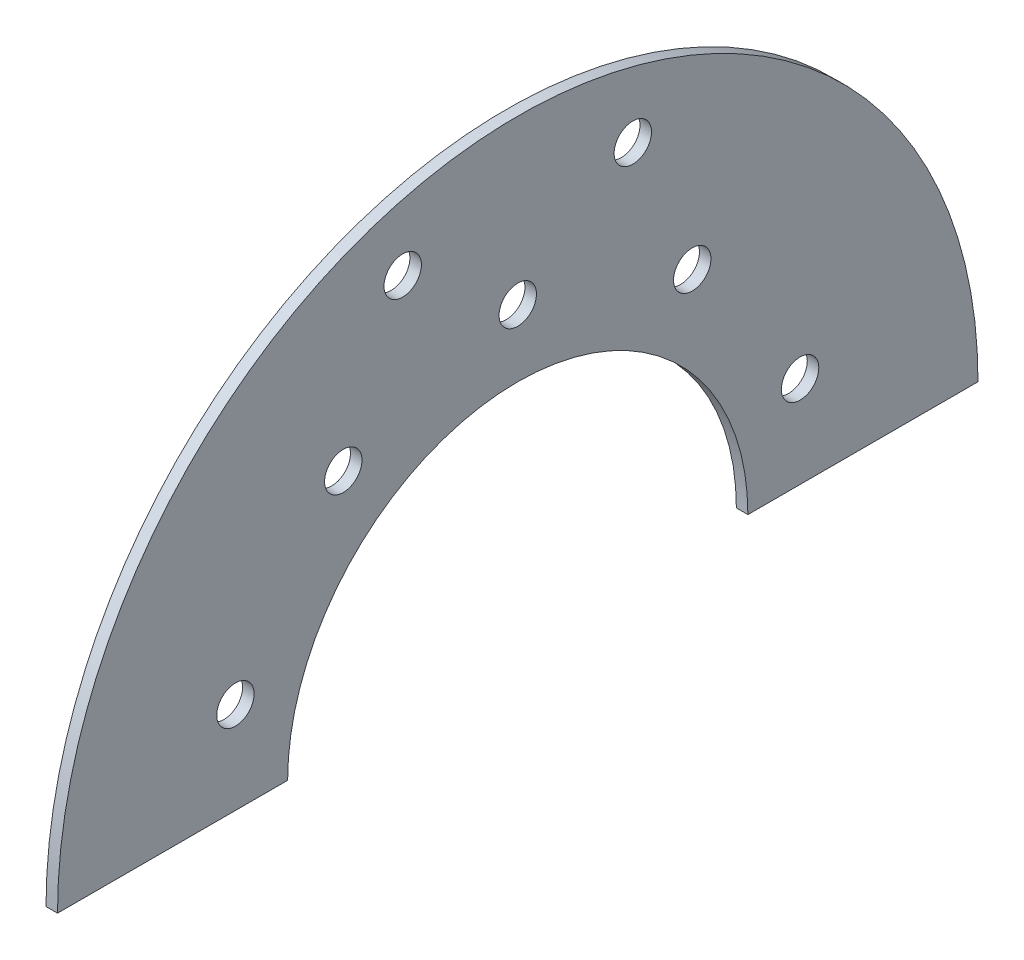
ISO-10303-21;
HEADER;
FILE_DESCRIPTION(('STEP AP214'),'2;1');
FILE_NAME('part.step','',(''),(''),'','','');
FILE_SCHEMA(('AUTOMOTIVE_DESIGN { 1 0 10303 214 1 1 1 1 }'));
ENDSEC;
DATA;
#1=APPLICATION_CONTEXT('core data for automotive mechanical design processes');
#2=APPLICATION_PROTOCOL_DEFINITION('international standard','automotive_design',2000,#1);
#3=PRODUCT_CONTEXT('',#1,'mechanical');
#4=PRODUCT('Part','Part','',(#3));
#5=PRODUCT_RELATED_PRODUCT_CATEGORY('part','',(#4));
#6=PRODUCT_DEFINITION_FORMATION('','',#4);
#7=PRODUCT_DEFINITION_CONTEXT('part definition',#1,'design');
#8=PRODUCT_DEFINITION('design','',#6,#7);
#9=PRODUCT_DEFINITION_SHAPE('','',#8);
#10=(LENGTH_UNIT() NAMED_UNIT(*) SI_UNIT(.MILLI.,.METRE.));
#11=(NAMED_UNIT(*) PLANE_ANGLE_UNIT() SI_UNIT($,.RADIAN.));
#12=(NAMED_UNIT(*) SI_UNIT($,.STERADIAN.) SOLID_ANGLE_UNIT());
#13=UNCERTAINTY_MEASURE_WITH_UNIT(LENGTH_MEASURE(1.E-05),#10,'distance_accuracy_value','');
#14=(GEOMETRIC_REPRESENTATION_CONTEXT(3) GLOBAL_UNCERTAINTY_ASSIGNED_CONTEXT((#13)) GLOBAL_UNIT_ASSIGNED_CONTEXT((#10,
#11,#12)) REPRESENTATION_CONTEXT('',''));
#15=CARTESIAN_POINT('',(0.,0.,0.));
#16=DIRECTION('',(0.,0.,1.));
#17=DIRECTION('',(1.,0.,0.));
#18=AXIS2_PLACEMENT_3D('',#15,#16,#17);
#19=CARTESIAN_POINT('',(0.,0.,0.));
#20=DIRECTION('',(0.,1.,0.));
#21=DIRECTION('',(0.,0.,1.));
#22=AXIS2_PLACEMENT_3D('',#19,#20,#21);
#23=PLANE('',#22);
#24=DIRECTION('',(0.,0.,1.));
#25=VECTOR('',#24,1.);
#26=CARTESIAN_POINT('',(2.,0.,0.));
#27=LINE('',#26,#25);
#28=CARTESIAN_POINT('',(2.,0.,-80.));
#29=VERTEX_POINT('',#28);
#30=CARTESIAN_POINT('',(2.,0.,-40.));
#31=VERTEX_POINT('',#30);
#32=EDGE_CURVE('E76',#29,#31,#27,.T.);
#33=ORIENTED_EDGE('',*,*,#32,.T.);
#34=DIRECTION('',(-1.,0.,0.));
#35=VECTOR('',#34,1.);
#36=CARTESIAN_POINT('',(2.,0.,-40.));
#37=LINE('',#36,#35);
#38=CARTESIAN_POINT('',(0.,0.,-40.));
#39=VERTEX_POINT('',#38);
#40=EDGE_CURVE('E40',#31,#39,#37,.T.);
#41=ORIENTED_EDGE('',*,*,#40,.T.);
#42=DIRECTION('',(0.,0.,1.));
#43=VECTOR('',#42,1.);
#44=CARTESIAN_POINT('',(0.,0.,0.));
#45=LINE('',#44,#43);
#46=CARTESIAN_POINT('',(0.,0.,-80.));
#47=VERTEX_POINT('',#46);
#48=EDGE_CURVE('E77',#47,#39,#45,.T.);
#49=ORIENTED_EDGE('',*,*,#48,.F.);
#50=DIRECTION('',(-1.,0.,0.));
#51=VECTOR('',#50,1.);
#52=CARTESIAN_POINT('',(2.,0.,-80.));
#53=LINE('',#52,#51);
#54=EDGE_CURVE('E35',#29,#47,#53,.T.);
#55=ORIENTED_EDGE('',*,*,#54,.F.);
#56=EDGE_LOOP('',(#33,#41,#49,#55));
#57=FACE_BOUND('',#56,.T.);
#58=ADVANCED_FACE('F32',(#57),#23,.F.);
#59=CARTESIAN_POINT('',(0.,0.,40.));
#60=VERTEX_POINT('',#59);
#61=CARTESIAN_POINT('',(0.,0.,80.));
#62=VERTEX_POINT('',#61);
#63=EDGE_CURVE('E82',#60,#62,#45,.T.);
#64=ORIENTED_EDGE('',*,*,#63,.F.);
#65=DIRECTION('',(-1.,0.,0.));
#66=VECTOR('',#65,1.);
#67=CARTESIAN_POINT('',(2.,0.,40.));
#68=LINE('',#67,#66);
#69=CARTESIAN_POINT('',(2.,0.,40.));
#70=VERTEX_POINT('',#69);
#71=EDGE_CURVE('E11',#60,#70,#68,.F.);
#72=ORIENTED_EDGE('',*,*,#71,.T.);
#73=CARTESIAN_POINT('',(2.,0.,80.));
#74=VERTEX_POINT('',#73);
#75=EDGE_CURVE('E55',#70,#74,#27,.T.);
#76=ORIENTED_EDGE('',*,*,#75,.T.);
#77=DIRECTION('',(-1.,0.,0.));
#78=VECTOR('',#77,1.);
#79=CARTESIAN_POINT('',(2.,0.,80.));
#80=LINE('',#79,#78);
#81=EDGE_CURVE('E83',#62,#74,#80,.F.);
#82=ORIENTED_EDGE('',*,*,#81,.F.);
#83=EDGE_LOOP('',(#64,#72,#76,#82));
#84=FACE_BOUND('',#83,.T.);
#85=ADVANCED_FACE('F100',(#84),#23,.F.);
#86=CARTESIAN_POINT('',(2.,0.,0.));
#87=DIRECTION('',(1.,0.,0.));
#88=DIRECTION('',(0.,0.,-1.));
#89=AXIS2_PLACEMENT_3D('',#86,#87,#88);
#90=PLANE('',#89);
#91=ORIENTED_EDGE('',*,*,#32,.F.);
#92=CARTESIAN_POINT('',(2.,0.,0.));
#93=DIRECTION('',(1.,0.,0.));
#94=DIRECTION('',(0.,0.,-1.));
#95=AXIS2_PLACEMENT_3D('',#92,#93,#94);
#96=CIRCLE('',#95,80.);
#97=EDGE_CURVE('E86',#29,#74,#96,.T.);
#98=ORIENTED_EDGE('',*,*,#97,.T.);
#99=ORIENTED_EDGE('',*,*,#75,.F.);
#100=CARTESIAN_POINT('',(2.,0.,0.));
#101=DIRECTION('',(1.,0.,0.));
#102=DIRECTION('',(0.,0.,-1.));
#103=AXIS2_PLACEMENT_3D('',#100,#101,#102);
#104=CIRCLE('',#103,40.);
#105=EDGE_CURVE('E87',#31,#70,#104,.T.);
#106=ORIENTED_EDGE('',*,*,#105,.F.);
#107=EDGE_LOOP('',(#91,#98,#99,#106));
#108=FACE_BOUND('',#107,.T.);
#109=CARTESIAN_POINT('',(2.,66.,20.));
#110=DIRECTION('',(1.,0.,0.));
#111=DIRECTION('',(0.,0.,-1.));
#112=AXIS2_PLACEMENT_3D('',#109,#110,#111);
#113=CIRCLE('',#112,3.25);
#114=CARTESIAN_POINT('',(2.,66.,16.75));
#115=VERTEX_POINT('',#114);
#116=EDGE_CURVE('E133',#115,#115,#113,.T.);
#117=ORIENTED_EDGE('',*,*,#116,.F.);
#118=EDGE_LOOP('',(#117));
#119=FACE_BOUND('',#118,.T.);
#120=CARTESIAN_POINT('',(2.,15.9452769097473,49.0745162408299));
#121=DIRECTION('',(1.,0.,0.));
#122=DIRECTION('',(0.,0.,-1.));
#123=AXIS2_PLACEMENT_3D('',#120,#121,#122);
#124=CIRCLE('',#123,3.25);
#125=CARTESIAN_POINT('',(2.,15.9452769097473,45.8245162408299));
#126=VERTEX_POINT('',#125);
#127=EDGE_CURVE('E121',#126,#126,#124,.T.);
#128=ORIENTED_EDGE('',*,*,#127,.F.);
#129=EDGE_LOOP('',(#128));
#130=FACE_BOUND('',#129,.T.);
#131=CARTESIAN_POINT('',(2.,15.9452769097473,-49.0745162408299));
#132=DIRECTION('',(1.,0.,0.));
#133=DIRECTION('',(0.,0.,-1.));
#134=AXIS2_PLACEMENT_3D('',#131,#132,#133);
#135=CIRCLE('',#134,3.25);
#136=CARTESIAN_POINT('',(2.,15.9452769097473,-52.3245162408299));
#137=VERTEX_POINT('',#136);
#138=EDGE_CURVE('E115',#137,#137,#135,.T.);
#139=ORIENTED_EDGE('',*,*,#138,.F.);
#140=EDGE_LOOP('',(#139));
#141=FACE_BOUND('',#140,.T.);
#142=CARTESIAN_POINT('',(2.,51.6,0.));
#143=DIRECTION('',(1.,0.,0.));
#144=DIRECTION('',(0.,0.,-1.));
#145=AXIS2_PLACEMENT_3D('',#142,#143,#144);
#146=CIRCLE('',#145,3.25);
#147=CARTESIAN_POINT('',(2.,51.6,-3.25));
#148=VERTEX_POINT('',#147);
#149=EDGE_CURVE('E104',#148,#148,#146,.T.);
#150=ORIENTED_EDGE('',*,*,#149,.F.);
#151=EDGE_LOOP('',(#150));
#152=FACE_BOUND('',#151,.T.);
#153=CARTESIAN_POINT('',(2.,41.7452769097473,-30.3297190182916));
#154=DIRECTION('',(1.,0.,0.));
#155=DIRECTION('',(0.,0.,-1.));
#156=AXIS2_PLACEMENT_3D('',#153,#154,#155);
#157=CIRCLE('',#156,3.25000000000001);
#158=CARTESIAN_POINT('',(2.,41.7452769097473,-33.5797190182916));
#159=VERTEX_POINT('',#158);
#160=EDGE_CURVE('E109',#159,#159,#157,.T.);
#161=ORIENTED_EDGE('',*,*,#160,.F.);
#162=EDGE_LOOP('',(#161));
#163=FACE_BOUND('',#162,.T.);
#164=CARTESIAN_POINT('',(2.,41.7452769097473,30.3297190182916));
#165=DIRECTION('',(1.,0.,0.));
#166=DIRECTION('',(0.,0.,-1.));
#167=AXIS2_PLACEMENT_3D('',#164,#165,#166);
#168=CIRCLE('',#167,3.25);
#169=CARTESIAN_POINT('',(2.,41.7452769097473,27.0797190182916));
#170=VERTEX_POINT('',#169);
#171=EDGE_CURVE('E127',#170,#170,#168,.T.);
#172=ORIENTED_EDGE('',*,*,#171,.F.);
#173=EDGE_LOOP('',(#172));
#174=FACE_BOUND('',#173,.T.);
#175=CARTESIAN_POINT('',(2.,66.,-20.));
#176=DIRECTION('',(1.,0.,0.));
#177=DIRECTION('',(0.,0.,-1.));
#178=AXIS2_PLACEMENT_3D('',#175,#176,#177);
#179=CIRCLE('',#178,3.25);
#180=CARTESIAN_POINT('',(2.,66.,-23.25));
#181=VERTEX_POINT('',#180);
#182=EDGE_CURVE('E139',#181,#181,#179,.T.);
#183=ORIENTED_EDGE('',*,*,#182,.F.);
#184=EDGE_LOOP('',(#183));
#185=FACE_BOUND('',#184,.T.);
#186=ADVANCED_FACE('F84',(#108,#119,#130,#141,#152,#163,#174,#185),#90,.T.);
#187=CARTESIAN_POINT('',(0.,0.,0.));
#188=DIRECTION('',(1.,0.,0.));
#189=DIRECTION('',(0.,0.,-1.));
#190=AXIS2_PLACEMENT_3D('',#187,#188,#189);
#191=PLANE('',#190);
#192=CARTESIAN_POINT('',(0.,0.,0.));
#193=DIRECTION('',(1.,0.,0.));
#194=DIRECTION('',(0.,0.,-1.));
#195=AXIS2_PLACEMENT_3D('',#192,#193,#194);
#196=CIRCLE('',#195,80.);
#197=EDGE_CURVE('E90',#47,#62,#196,.T.);
#198=ORIENTED_EDGE('',*,*,#197,.F.);
#199=ORIENTED_EDGE('',*,*,#48,.T.);
#200=CARTESIAN_POINT('',(0.,0.,0.));
#201=DIRECTION('',(1.,0.,0.));
#202=DIRECTION('',(0.,0.,-1.));
#203=AXIS2_PLACEMENT_3D('',#200,#201,#202);
#204=CIRCLE('',#203,40.);
#205=EDGE_CURVE('E94',#39,#60,#204,.T.);
#206=ORIENTED_EDGE('',*,*,#205,.T.);
#207=ORIENTED_EDGE('',*,*,#63,.T.);
#208=EDGE_LOOP('',(#198,#199,#206,#207));
#209=FACE_BOUND('',#208,.T.);
#210=CARTESIAN_POINT('',(0.,51.6,0.));
#211=DIRECTION('',(1.,0.,0.));
#212=DIRECTION('',(0.,0.,-1.));
#213=AXIS2_PLACEMENT_3D('',#210,#211,#212);
#214=CIRCLE('',#213,3.25);
#215=CARTESIAN_POINT('',(0.,51.6,-3.25));
#216=VERTEX_POINT('',#215);
#217=EDGE_CURVE('E106',#216,#216,#214,.T.);
#218=ORIENTED_EDGE('',*,*,#217,.T.);
#219=EDGE_LOOP('',(#218));
#220=FACE_BOUND('',#219,.T.);
#221=CARTESIAN_POINT('',(0.,41.7452769097473,-30.3297190182916));
#222=DIRECTION('',(1.,0.,0.));
#223=DIRECTION('',(0.,0.,-1.));
#224=AXIS2_PLACEMENT_3D('',#221,#222,#223);
#225=CIRCLE('',#224,3.25000000000001);
#226=CARTESIAN_POINT('',(0.,41.7452769097473,-33.5797190182916));
#227=VERTEX_POINT('',#226);
#228=EDGE_CURVE('E112',#227,#227,#225,.T.);
#229=ORIENTED_EDGE('',*,*,#228,.T.);
#230=EDGE_LOOP('',(#229));
#231=FACE_BOUND('',#230,.T.);
#232=CARTESIAN_POINT('',(0.,15.9452769097473,-49.0745162408299));
#233=DIRECTION('',(1.,0.,0.));
#234=DIRECTION('',(0.,0.,-1.));
#235=AXIS2_PLACEMENT_3D('',#232,#233,#234);
#236=CIRCLE('',#235,3.25);
#237=CARTESIAN_POINT('',(0.,15.9452769097473,-52.3245162408299));
#238=VERTEX_POINT('',#237);
#239=EDGE_CURVE('E118',#238,#238,#236,.T.);
#240=ORIENTED_EDGE('',*,*,#239,.T.);
#241=EDGE_LOOP('',(#240));
#242=FACE_BOUND('',#241,.T.);
#243=CARTESIAN_POINT('',(0.,15.9452769097473,49.0745162408299));
#244=DIRECTION('',(1.,0.,0.));
#245=DIRECTION('',(0.,0.,-1.));
#246=AXIS2_PLACEMENT_3D('',#243,#244,#245);
#247=CIRCLE('',#246,3.25);
#248=CARTESIAN_POINT('',(0.,15.9452769097473,45.8245162408299));
#249=VERTEX_POINT('',#248);
#250=EDGE_CURVE('E124',#249,#249,#247,.T.);
#251=ORIENTED_EDGE('',*,*,#250,.T.);
#252=EDGE_LOOP('',(#251));
#253=FACE_BOUND('',#252,.T.);
#254=CARTESIAN_POINT('',(0.,41.7452769097473,30.3297190182916));
#255=DIRECTION('',(1.,0.,0.));
#256=DIRECTION('',(0.,0.,-1.));
#257=AXIS2_PLACEMENT_3D('',#254,#255,#256);
#258=CIRCLE('',#257,3.25);
#259=CARTESIAN_POINT('',(0.,41.7452769097473,27.0797190182916));
#260=VERTEX_POINT('',#259);
#261=EDGE_CURVE('E130',#260,#260,#258,.T.);
#262=ORIENTED_EDGE('',*,*,#261,.T.);
#263=EDGE_LOOP('',(#262));
#264=FACE_BOUND('',#263,.T.);
#265=CARTESIAN_POINT('',(0.,66.,20.));
#266=DIRECTION('',(1.,0.,0.));
#267=DIRECTION('',(0.,0.,-1.));
#268=AXIS2_PLACEMENT_3D('',#265,#266,#267);
#269=CIRCLE('',#268,3.25);
#270=CARTESIAN_POINT('',(0.,66.,16.75));
#271=VERTEX_POINT('',#270);
#272=EDGE_CURVE('E136',#271,#271,#269,.T.);
#273=ORIENTED_EDGE('',*,*,#272,.T.);
#274=EDGE_LOOP('',(#273));
#275=FACE_BOUND('',#274,.T.);
#276=CARTESIAN_POINT('',(0.,66.,-20.));
#277=DIRECTION('',(1.,0.,0.));
#278=DIRECTION('',(0.,0.,-1.));
#279=AXIS2_PLACEMENT_3D('',#276,#277,#278);
#280=CIRCLE('',#279,3.25);
#281=CARTESIAN_POINT('',(0.,66.,-23.25));
#282=VERTEX_POINT('',#281);
#283=EDGE_CURVE('E142',#282,#282,#280,.T.);
#284=ORIENTED_EDGE('',*,*,#283,.T.);
#285=EDGE_LOOP('',(#284));
#286=FACE_BOUND('',#285,.T.);
#287=ADVANCED_FACE('F152',(#209,#220,#231,#242,#253,#264,#275,#286),#191,.F.);
#288=CARTESIAN_POINT('',(2.,0.,0.));
#289=DIRECTION('',(-1.,0.,0.));
#290=DIRECTION('',(0.,0.,1.));
#291=AXIS2_PLACEMENT_3D('',#288,#289,#290);
#292=CYLINDRICAL_SURFACE('',#291,80.);
#293=ORIENTED_EDGE('',*,*,#97,.F.);
#294=ORIENTED_EDGE('',*,*,#54,.T.);
#295=ORIENTED_EDGE('',*,*,#197,.T.);
#296=ORIENTED_EDGE('',*,*,#81,.T.);
#297=EDGE_LOOP('',(#293,#294,#295,#296));
#298=FACE_BOUND('',#297,.T.);
#299=ADVANCED_FACE('F89',(#298),#292,.T.);
#300=CARTESIAN_POINT('',(2.,0.,0.));
#301=DIRECTION('',(-1.,0.,0.));
#302=DIRECTION('',(0.,0.,1.));
#303=AXIS2_PLACEMENT_3D('',#300,#301,#302);
#304=CYLINDRICAL_SURFACE('',#303,40.);
#305=ORIENTED_EDGE('',*,*,#40,.F.);
#306=ORIENTED_EDGE('',*,*,#105,.T.);
#307=ORIENTED_EDGE('',*,*,#71,.F.);
#308=ORIENTED_EDGE('',*,*,#205,.F.);
#309=EDGE_LOOP('',(#305,#306,#307,#308));
#310=FACE_BOUND('',#309,.T.);
#311=ADVANCED_FACE('F103',(#310),#304,.F.);
#312=CARTESIAN_POINT('',(2.,51.6,0.));
#313=DIRECTION('',(-1.,0.,0.));
#314=DIRECTION('',(0.,0.,1.));
#315=AXIS2_PLACEMENT_3D('',#312,#313,#314);
#316=CYLINDRICAL_SURFACE('',#315,3.25);
#317=ORIENTED_EDGE('',*,*,#149,.T.);
#318=EDGE_LOOP('',(#317));
#319=FACE_BOUND('',#318,.T.);
#320=ORIENTED_EDGE('',*,*,#217,.F.);
#321=EDGE_LOOP('',(#320));
#322=FACE_BOUND('',#321,.T.);
#323=ADVANCED_FACE('F202',(#319,#322),#316,.F.);
#324=CARTESIAN_POINT('',(2.,41.7452769097473,-30.3297190182916));
#325=DIRECTION('',(-1.,0.,0.));
#326=DIRECTION('',(0.,0.,1.));
#327=AXIS2_PLACEMENT_3D('',#324,#325,#326);
#328=CYLINDRICAL_SURFACE('',#327,3.25000000000001);
#329=ORIENTED_EDGE('',*,*,#160,.T.);
#330=EDGE_LOOP('',(#329));
#331=FACE_BOUND('',#330,.T.);
#332=ORIENTED_EDGE('',*,*,#228,.F.);
#333=EDGE_LOOP('',(#332));
#334=FACE_BOUND('',#333,.T.);
#335=ADVANCED_FACE('F209',(#331,#334),#328,.F.);
#336=CARTESIAN_POINT('',(2.,15.9452769097473,-49.0745162408299));
#337=DIRECTION('',(-1.,0.,0.));
#338=DIRECTION('',(0.,0.,1.));
#339=AXIS2_PLACEMENT_3D('',#336,#337,#338);
#340=CYLINDRICAL_SURFACE('',#339,3.25);
#341=ORIENTED_EDGE('',*,*,#138,.T.);
#342=EDGE_LOOP('',(#341));
#343=FACE_BOUND('',#342,.T.);
#344=ORIENTED_EDGE('',*,*,#239,.F.);
#345=EDGE_LOOP('',(#344));
#346=FACE_BOUND('',#345,.T.);
#347=ADVANCED_FACE('F217',(#343,#346),#340,.F.);
#348=CARTESIAN_POINT('',(2.,15.9452769097473,49.0745162408299));
#349=DIRECTION('',(-1.,0.,0.));
#350=DIRECTION('',(0.,0.,1.));
#351=AXIS2_PLACEMENT_3D('',#348,#349,#350);
#352=CYLINDRICAL_SURFACE('',#351,3.25);
#353=ORIENTED_EDGE('',*,*,#127,.T.);
#354=EDGE_LOOP('',(#353));
#355=FACE_BOUND('',#354,.T.);
#356=ORIENTED_EDGE('',*,*,#250,.F.);
#357=EDGE_LOOP('',(#356));
#358=FACE_BOUND('',#357,.T.);
#359=ADVANCED_FACE('F226',(#355,#358),#352,.F.);
#360=CARTESIAN_POINT('',(2.,41.7452769097473,30.3297190182916));
#361=DIRECTION('',(-1.,0.,0.));
#362=DIRECTION('',(0.,0.,1.));
#363=AXIS2_PLACEMENT_3D('',#360,#361,#362);
#364=CYLINDRICAL_SURFACE('',#363,3.25);
#365=ORIENTED_EDGE('',*,*,#171,.T.);
#366=EDGE_LOOP('',(#365));
#367=FACE_BOUND('',#366,.T.);
#368=ORIENTED_EDGE('',*,*,#261,.F.);
#369=EDGE_LOOP('',(#368));
#370=FACE_BOUND('',#369,.T.);
#371=ADVANCED_FACE('F235',(#367,#370),#364,.F.);
#372=CARTESIAN_POINT('',(2.,66.,20.));
#373=DIRECTION('',(-1.,0.,0.));
#374=DIRECTION('',(0.,0.,1.));
#375=AXIS2_PLACEMENT_3D('',#372,#373,#374);
#376=CYLINDRICAL_SURFACE('',#375,3.25);
#377=ORIENTED_EDGE('',*,*,#116,.T.);
#378=EDGE_LOOP('',(#377));
#379=FACE_BOUND('',#378,.T.);
#380=ORIENTED_EDGE('',*,*,#272,.F.);
#381=EDGE_LOOP('',(#380));
#382=FACE_BOUND('',#381,.T.);
#383=ADVANCED_FACE('F244',(#379,#382),#376,.F.);
#384=CARTESIAN_POINT('',(2.,66.,-20.));
#385=DIRECTION('',(-1.,0.,0.));
#386=DIRECTION('',(0.,0.,1.));
#387=AXIS2_PLACEMENT_3D('',#384,#385,#386);
#388=CYLINDRICAL_SURFACE('',#387,3.25);
#389=ORIENTED_EDGE('',*,*,#182,.T.);
#390=EDGE_LOOP('',(#389));
#391=FACE_BOUND('',#390,.T.);
#392=ORIENTED_EDGE('',*,*,#283,.F.);
#393=EDGE_LOOP('',(#392));
#394=FACE_BOUND('',#393,.T.);
#395=ADVANCED_FACE('F148',(#391,#394),#388,.F.);
#396=CLOSED_SHELL('',(#58,#85,#186,#287,#299,#311,#323,#335,#347,#359,#371,#383,#395));
#397=MANIFOLD_SOLID_BREP('B2',#396);
#398=ADVANCED_BREP_SHAPE_REPRESENTATION('',(#18,#397),#14);
#399=SHAPE_DEFINITION_REPRESENTATION(#9,#398);
ENDSEC;
END-ISO-10303-21;
